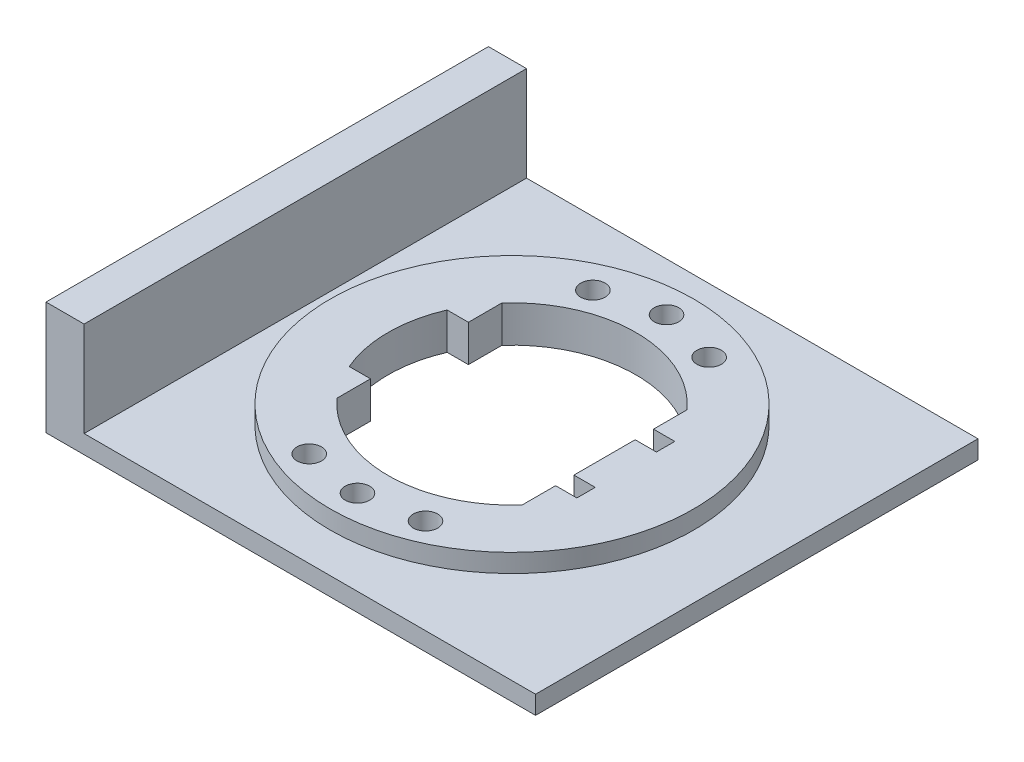
ISO-10303-21;
HEADER;
FILE_DESCRIPTION(('STEP AP214'),'2;1');
FILE_NAME('part.step','',(''),(''),'','','');
FILE_SCHEMA(('AUTOMOTIVE_DESIGN { 1 0 10303 214 1 1 1 1 }'));
ENDSEC;
DATA;
#1=APPLICATION_CONTEXT('core data for automotive mechanical design processes');
#2=APPLICATION_PROTOCOL_DEFINITION('international standard','automotive_design',2000,#1);
#3=PRODUCT_CONTEXT('',#1,'mechanical');
#4=PRODUCT('Part','Part','',(#3));
#5=PRODUCT_RELATED_PRODUCT_CATEGORY('part','',(#4));
#6=PRODUCT_DEFINITION_FORMATION('','',#4);
#7=PRODUCT_DEFINITION_CONTEXT('part definition',#1,'design');
#8=PRODUCT_DEFINITION('design','',#6,#7);
#9=PRODUCT_DEFINITION_SHAPE('','',#8);
#10=(LENGTH_UNIT() NAMED_UNIT(*) SI_UNIT(.MILLI.,.METRE.));
#11=(NAMED_UNIT(*) PLANE_ANGLE_UNIT() SI_UNIT($,.RADIAN.));
#12=(NAMED_UNIT(*) SI_UNIT($,.STERADIAN.) SOLID_ANGLE_UNIT());
#13=UNCERTAINTY_MEASURE_WITH_UNIT(LENGTH_MEASURE(1.E-05),#10,'distance_accuracy_value','');
#14=(GEOMETRIC_REPRESENTATION_CONTEXT(3) GLOBAL_UNCERTAINTY_ASSIGNED_CONTEXT((#13)) GLOBAL_UNIT_ASSIGNED_CONTEXT((#10,
#11,#12)) REPRESENTATION_CONTEXT('',''));
#15=CARTESIAN_POINT('',(0.,0.,0.));
#16=DIRECTION('',(0.,0.,1.));
#17=DIRECTION('',(1.,0.,0.));
#18=AXIS2_PLACEMENT_3D('',#15,#16,#17);
#19=CARTESIAN_POINT('',(-38.4533424136748,3.,-1.51012870901468));
#20=DIRECTION('',(0.,1.,0.));
#21=DIRECTION('',(0.,0.,1.));
#22=AXIS2_PLACEMENT_3D('',#19,#20,#21);
#23=PLANE('',#22);
#24=CARTESIAN_POINT('',(1.54665758632518,3.,-37.6601287090147));
#25=DIRECTION('',(0.,1.,0.));
#26=DIRECTION('',(0.,0.,1.));
#27=AXIS2_PLACEMENT_3D('',#24,#25,#26);
#28=CIRCLE('',#27,29.705);
#29=CARTESIAN_POINT('',(1.54665758632518,3.,-7.95512870901468));
#30=VERTEX_POINT('',#29);
#31=EDGE_CURVE('E367',#30,#30,#28,.T.);
#32=ORIENTED_EDGE('',*,*,#31,.F.);
#33=EDGE_LOOP('',(#32));
#34=FACE_BOUND('',#33,.T.);
#35=DIRECTION('',(-1.,0.,0.));
#36=VECTOR('',#35,1.);
#37=CARTESIAN_POINT('',(-38.4533424136748,3.,-73.8101287090147));
#38=LINE('',#37,#36);
#39=CARTESIAN_POINT('',(41.5466575863252,3.,-73.8101287090147));
#40=VERTEX_POINT('',#39);
#41=CARTESIAN_POINT('',(-32.2275933760281,3.,-73.8101287090147));
#42=VERTEX_POINT('',#41);
#43=EDGE_CURVE('E46',#40,#42,#38,.T.);
#44=ORIENTED_EDGE('',*,*,#43,.T.);
#45=DIRECTION('',(0.,0.,-1.));
#46=VECTOR('',#45,1.);
#47=CARTESIAN_POINT('',(-32.2275933760281,3.,-73.8101287090147));
#48=LINE('',#47,#46);
#49=CARTESIAN_POINT('',(-32.2275933760281,3.,-1.51012870901468));
#50=VERTEX_POINT('',#49);
#51=EDGE_CURVE('E50',#50,#42,#48,.T.);
#52=ORIENTED_EDGE('',*,*,#51,.F.);
#53=DIRECTION('',(1.,0.,0.));
#54=VECTOR('',#53,1.);
#55=CARTESIAN_POINT('',(-38.4533424136748,3.,-1.51012870901468));
#56=LINE('',#55,#54);
#57=CARTESIAN_POINT('',(41.5466575863252,3.,-1.51012870901468));
#58=VERTEX_POINT('',#57);
#59=EDGE_CURVE('E370',#50,#58,#56,.T.);
#60=ORIENTED_EDGE('',*,*,#59,.T.);
#61=DIRECTION('',(0.,0.,-1.));
#62=VECTOR('',#61,1.);
#63=CARTESIAN_POINT('',(41.5466575863252,3.,-73.8101287090147));
#64=LINE('',#63,#62);
#65=EDGE_CURVE('E374',#58,#40,#64,.T.);
#66=ORIENTED_EDGE('',*,*,#65,.T.);
#67=EDGE_LOOP('',(#44,#52,#60,#66));
#68=FACE_BOUND('',#67,.T.);
#69=ADVANCED_FACE('F31',(#34,#68),#23,.T.);
#70=CARTESIAN_POINT('',(-38.4533424136748,0.,-73.8101287090147));
#71=DIRECTION('',(0.,-1.,0.));
#72=DIRECTION('',(0.,0.,-1.));
#73=AXIS2_PLACEMENT_3D('',#70,#71,#72);
#74=PLANE('',#73);
#75=CARTESIAN_POINT('',(-7.95334241367481,0.,-14.0265658129032));
#76=DIRECTION('',(0.,1.,0.));
#77=DIRECTION('',(0.,0.,1.));
#78=AXIS2_PLACEMENT_3D('',#75,#76,#77);
#79=CIRCLE('',#78,2.00000000000001);
#80=CARTESIAN_POINT('',(-7.95334241367481,0.,-12.0265658129032));
#81=VERTEX_POINT('',#80);
#82=EDGE_CURVE('E208',#81,#81,#79,.T.);
#83=ORIENTED_EDGE('',*,*,#82,.T.);
#84=EDGE_LOOP('',(#83));
#85=FACE_BOUND('',#84,.T.);
#86=CARTESIAN_POINT('',(11.0466575863252,0.,-14.0265658129032));
#87=DIRECTION('',(0.,1.,0.));
#88=DIRECTION('',(0.,0.,1.));
#89=AXIS2_PLACEMENT_3D('',#86,#87,#88);
#90=CIRCLE('',#89,2.);
#91=CARTESIAN_POINT('',(11.0466575863252,0.,-12.0265658129032));
#92=VERTEX_POINT('',#91);
#93=EDGE_CURVE('E214',#92,#92,#90,.T.);
#94=ORIENTED_EDGE('',*,*,#93,.T.);
#95=EDGE_LOOP('',(#94));
#96=FACE_BOUND('',#95,.T.);
#97=CARTESIAN_POINT('',(11.0466575863252,0.,-60.3765658129032));
#98=DIRECTION('',(0.,1.,0.));
#99=DIRECTION('',(0.,0.,1.));
#100=AXIS2_PLACEMENT_3D('',#97,#98,#99);
#101=CIRCLE('',#100,2.);
#102=CARTESIAN_POINT('',(11.0466575863252,0.,-58.3765658129032));
#103=VERTEX_POINT('',#102);
#104=EDGE_CURVE('E220',#103,#103,#101,.T.);
#105=ORIENTED_EDGE('',*,*,#104,.T.);
#106=EDGE_LOOP('',(#105));
#107=FACE_BOUND('',#106,.T.);
#108=CARTESIAN_POINT('',(-7.95334241367482,0.,-60.3765658129032));
#109=DIRECTION('',(0.,1.,0.));
#110=DIRECTION('',(0.,0.,1.));
#111=AXIS2_PLACEMENT_3D('',#108,#109,#110);
#112=CIRCLE('',#111,2.00000000000001);
#113=CARTESIAN_POINT('',(-7.95334241367482,0.,-58.3765658129032));
#114=VERTEX_POINT('',#113);
#115=EDGE_CURVE('E226',#114,#114,#112,.T.);
#116=ORIENTED_EDGE('',*,*,#115,.T.);
#117=EDGE_LOOP('',(#116));
#118=FACE_BOUND('',#117,.T.);
#119=CARTESIAN_POINT('',(1.54665758632519,0.,-62.9101287090147));
#120=DIRECTION('',(0.,1.,0.));
#121=DIRECTION('',(0.,0.,1.));
#122=AXIS2_PLACEMENT_3D('',#119,#120,#121);
#123=CIRCLE('',#122,2.);
#124=CARTESIAN_POINT('',(1.54665758632519,0.,-60.9101287090147));
#125=VERTEX_POINT('',#124);
#126=EDGE_CURVE('E232',#125,#125,#123,.T.);
#127=ORIENTED_EDGE('',*,*,#126,.T.);
#128=EDGE_LOOP('',(#127));
#129=FACE_BOUND('',#128,.T.);
#130=CARTESIAN_POINT('',(1.54665758632519,0.,-12.4101287090147));
#131=DIRECTION('',(0.,1.,0.));
#132=DIRECTION('',(0.,0.,1.));
#133=AXIS2_PLACEMENT_3D('',#130,#131,#132);
#134=CIRCLE('',#133,2.);
#135=CARTESIAN_POINT('',(1.54665758632519,0.,-10.4101287090147));
#136=VERTEX_POINT('',#135);
#137=EDGE_CURVE('E238',#136,#136,#134,.T.);
#138=ORIENTED_EDGE('',*,*,#137,.T.);
#139=EDGE_LOOP('',(#138));
#140=FACE_BOUND('',#139,.T.);
#141=DIRECTION('',(0.,0.,1.));
#142=VECTOR('',#141,1.);
#143=CARTESIAN_POINT('',(-38.4533424136748,0.,-1.51012870901468));
#144=LINE('',#143,#142);
#145=CARTESIAN_POINT('',(-38.4533424136748,0.,-73.8101287090147));
#146=VERTEX_POINT('',#145);
#147=CARTESIAN_POINT('',(-38.4533424136748,0.,-1.51012870901468));
#148=VERTEX_POINT('',#147);
#149=EDGE_CURVE('E181',#146,#148,#144,.T.);
#150=ORIENTED_EDGE('',*,*,#149,.F.);
#151=DIRECTION('',(-1.,0.,0.));
#152=VECTOR('',#151,1.);
#153=CARTESIAN_POINT('',(-38.4533424136748,0.,-73.8101287090147));
#154=LINE('',#153,#152);
#155=CARTESIAN_POINT('',(41.5466575863252,0.,-73.8101287090147));
#156=VERTEX_POINT('',#155);
#157=EDGE_CURVE('E383',#156,#146,#154,.T.);
#158=ORIENTED_EDGE('',*,*,#157,.F.);
#159=DIRECTION('',(0.,0.,-1.));
#160=VECTOR('',#159,1.);
#161=CARTESIAN_POINT('',(41.5466575863252,0.,-1.51012870901468));
#162=LINE('',#161,#160);
#163=CARTESIAN_POINT('',(41.5466575863252,0.,-1.51012870901468));
#164=VERTEX_POINT('',#163);
#165=EDGE_CURVE('E380',#164,#156,#162,.T.);
#166=ORIENTED_EDGE('',*,*,#165,.F.);
#167=DIRECTION('',(1.,0.,0.));
#168=VECTOR('',#167,1.);
#169=CARTESIAN_POINT('',(-38.4533424136748,0.,-1.51012870901468));
#170=LINE('',#169,#168);
#171=EDGE_CURVE('E378',#148,#164,#170,.T.);
#172=ORIENTED_EDGE('',*,*,#171,.F.);
#173=EDGE_LOOP('',(#150,#158,#166,#172));
#174=FACE_BOUND('',#173,.T.);
#175=DIRECTION('',(0.,0.,1.));
#176=VECTOR('',#175,1.);
#177=CARTESIAN_POINT('',(-13.5780333196074,0.,-37.6601287090147));
#178=LINE('',#177,#176);
#179=CARTESIAN_POINT('',(-13.5780333196074,0.,-51.1251287090147));
#180=VERTEX_POINT('',#179);
#181=CARTESIAN_POINT('',(-13.5780333196074,0.,-45.6601287090147));
#182=VERTEX_POINT('',#181);
#183=EDGE_CURVE('E284',#180,#182,#178,.T.);
#184=ORIENTED_EDGE('',*,*,#183,.T.);
#185=DIRECTION('',(1.,0.,0.));
#186=VECTOR('',#185,1.);
#187=CARTESIAN_POINT('',(-63.9457637699121,0.,-45.6601287090147));
#188=LINE('',#187,#186);
#189=CARTESIAN_POINT('',(-17.0560975859605,0.,-45.6601287090147));
#190=VERTEX_POINT('',#189);
#191=EDGE_CURVE('E244',#190,#182,#188,.T.);
#192=ORIENTED_EDGE('',*,*,#191,.F.);
#193=CARTESIAN_POINT('',(1.54665758632518,0.,-37.6601287090147));
#194=DIRECTION('',(0.,1.,0.));
#195=DIRECTION('',(0.,0.,1.));
#196=AXIS2_PLACEMENT_3D('',#193,#194,#195);
#197=CIRCLE('',#196,20.25);
#198=CARTESIAN_POINT('',(-17.0560975859605,0.,-29.6601287090147));
#199=VERTEX_POINT('',#198);
#200=EDGE_CURVE('E246',#190,#199,#197,.T.);
#201=ORIENTED_EDGE('',*,*,#200,.T.);
#202=DIRECTION('',(1.,0.,0.));
#203=VECTOR('',#202,1.);
#204=CARTESIAN_POINT('',(-63.9457637699121,0.,-29.6601287090147));
#205=LINE('',#204,#203);
#206=CARTESIAN_POINT('',(-13.5780333196074,0.,-29.6601287090147));
#207=VERTEX_POINT('',#206);
#208=EDGE_CURVE('E250',#199,#207,#205,.T.);
#209=ORIENTED_EDGE('',*,*,#208,.T.);
#210=DIRECTION('',(0.,0.,1.));
#211=VECTOR('',#210,1.);
#212=CARTESIAN_POINT('',(-13.5780333196074,0.,-37.6601287090147));
#213=LINE('',#212,#211);
#214=CARTESIAN_POINT('',(-13.5780333196074,0.,-24.1951287090147));
#215=VERTEX_POINT('',#214);
#216=EDGE_CURVE('E253',#207,#215,#213,.T.);
#217=ORIENTED_EDGE('',*,*,#216,.T.);
#218=CARTESIAN_POINT('',(1.54665758632518,0.,-37.6601287090147));
#219=DIRECTION('',(0.,1.,0.));
#220=DIRECTION('',(0.,0.,1.));
#221=AXIS2_PLACEMENT_3D('',#218,#219,#220);
#222=CIRCLE('',#221,20.25);
#223=CARTESIAN_POINT('',(16.6713484922578,0.,-24.1951287090147));
#224=VERTEX_POINT('',#223);
#225=EDGE_CURVE('E256',#215,#224,#222,.T.);
#226=ORIENTED_EDGE('',*,*,#225,.T.);
#227=DIRECTION('',(0.,0.,1.));
#228=VECTOR('',#227,1.);
#229=CARTESIAN_POINT('',(16.6713484922578,0.,-37.6601287090147));
#230=LINE('',#229,#228);
#231=CARTESIAN_POINT('',(16.6713484922578,0.,-29.6601287090147));
#232=VERTEX_POINT('',#231);
#233=EDGE_CURVE('E259',#232,#224,#230,.T.);
#234=ORIENTED_EDGE('',*,*,#233,.F.);
#235=DIRECTION('',(1.,0.,0.));
#236=VECTOR('',#235,1.);
#237=CARTESIAN_POINT('',(-63.9457637699121,0.,-29.6601287090147));
#238=LINE('',#237,#236);
#239=CARTESIAN_POINT('',(20.1494127586108,0.,-29.6601287090147));
#240=VERTEX_POINT('',#239);
#241=EDGE_CURVE('E261',#232,#240,#238,.T.);
#242=ORIENTED_EDGE('',*,*,#241,.T.);
#243=DIRECTION('',(0.,0.,-1.));
#244=VECTOR('',#243,1.);
#245=CARTESIAN_POINT('',(20.1494127586108,0.,-37.6601287090147));
#246=LINE('',#245,#244);
#247=CARTESIAN_POINT('',(20.1494127586108,0.,-32.6601287090147));
#248=VERTEX_POINT('',#247);
#249=EDGE_CURVE('E264',#240,#248,#246,.T.);
#250=ORIENTED_EDGE('',*,*,#249,.T.);
#251=DIRECTION('',(-1.,0.,0.));
#252=VECTOR('',#251,1.);
#253=CARTESIAN_POINT('',(-63.9457637699121,0.,-32.6601287090148));
#254=LINE('',#253,#252);
#255=CARTESIAN_POINT('',(16.6713484922578,0.,-32.6601287090147));
#256=VERTEX_POINT('',#255);
#257=EDGE_CURVE('E267',#248,#256,#254,.T.);
#258=ORIENTED_EDGE('',*,*,#257,.T.);
#259=DIRECTION('',(0.,0.,1.));
#260=VECTOR('',#259,1.);
#261=CARTESIAN_POINT('',(16.6713484922578,0.,-37.6601287090147));
#262=LINE('',#261,#260);
#263=CARTESIAN_POINT('',(16.6713484922578,0.,-42.6601287090147));
#264=VERTEX_POINT('',#263);
#265=EDGE_CURVE('E270',#264,#256,#262,.T.);
#266=ORIENTED_EDGE('',*,*,#265,.F.);
#267=DIRECTION('',(-1.,0.,0.));
#268=VECTOR('',#267,1.);
#269=CARTESIAN_POINT('',(-63.9457637699121,0.,-42.6601287090147));
#270=LINE('',#269,#268);
#271=CARTESIAN_POINT('',(20.1494127586108,0.,-42.6601287090147));
#272=VERTEX_POINT('',#271);
#273=EDGE_CURVE('E272',#272,#264,#270,.T.);
#274=ORIENTED_EDGE('',*,*,#273,.F.);
#275=DIRECTION('',(0.,0.,-1.));
#276=VECTOR('',#275,1.);
#277=CARTESIAN_POINT('',(20.1494127586108,0.,-37.6601287090147));
#278=LINE('',#277,#276);
#279=CARTESIAN_POINT('',(20.1494127586108,0.,-45.6601287090147));
#280=VERTEX_POINT('',#279);
#281=EDGE_CURVE('E274',#272,#280,#278,.T.);
#282=ORIENTED_EDGE('',*,*,#281,.T.);
#283=DIRECTION('',(1.,0.,0.));
#284=VECTOR('',#283,1.);
#285=CARTESIAN_POINT('',(-63.9457637699121,0.,-45.6601287090147));
#286=LINE('',#285,#284);
#287=CARTESIAN_POINT('',(16.6713484922578,0.,-45.6601287090147));
#288=VERTEX_POINT('',#287);
#289=EDGE_CURVE('E277',#288,#280,#286,.T.);
#290=ORIENTED_EDGE('',*,*,#289,.F.);
#291=DIRECTION('',(0.,0.,1.));
#292=VECTOR('',#291,1.);
#293=CARTESIAN_POINT('',(16.6713484922578,0.,-37.6601287090147));
#294=LINE('',#293,#292);
#295=CARTESIAN_POINT('',(16.6713484922578,0.,-51.1251287090147));
#296=VERTEX_POINT('',#295);
#297=EDGE_CURVE('E279',#296,#288,#294,.T.);
#298=ORIENTED_EDGE('',*,*,#297,.F.);
#299=CARTESIAN_POINT('',(1.54665758632518,0.,-37.6601287090147));
#300=DIRECTION('',(0.,1.,0.));
#301=DIRECTION('',(0.,0.,1.));
#302=AXIS2_PLACEMENT_3D('',#299,#300,#301);
#303=CIRCLE('',#302,20.25);
#304=EDGE_CURVE('E281',#296,#180,#303,.T.);
#305=ORIENTED_EDGE('',*,*,#304,.T.);
#306=EDGE_LOOP('',(#184,#192,#201,#209,#217,#226,#234,#242,#250,#258,#266,#274,#282,#290,#298,#305));
#307=FACE_BOUND('',#306,.T.);
#308=ADVANCED_FACE('F397',(#85,#96,#107,#118,#129,#140,#174,#307),#74,.T.);
#309=CARTESIAN_POINT('',(-38.4533424136748,6.,-73.8101287090147));
#310=DIRECTION('',(0.,-1.,0.));
#311=DIRECTION('',(0.,0.,-1.));
#312=AXIS2_PLACEMENT_3D('',#309,#310,#311);
#313=PLANE('',#312);
#314=CARTESIAN_POINT('',(-7.95334241367481,6.,-14.0265658129032));
#315=DIRECTION('',(0.,1.,0.));
#316=DIRECTION('',(0.,0.,1.));
#317=AXIS2_PLACEMENT_3D('',#314,#315,#316);
#318=CIRCLE('',#317,2.00000000000001);
#319=CARTESIAN_POINT('',(-7.95334241367481,6.,-12.0265658129032));
#320=VERTEX_POINT('',#319);
#321=EDGE_CURVE('E207',#320,#320,#318,.T.);
#322=ORIENTED_EDGE('',*,*,#321,.F.);
#323=EDGE_LOOP('',(#322));
#324=FACE_BOUND('',#323,.T.);
#325=CARTESIAN_POINT('',(11.0466575863252,6.,-14.0265658129032));
#326=DIRECTION('',(0.,1.,0.));
#327=DIRECTION('',(0.,0.,1.));
#328=AXIS2_PLACEMENT_3D('',#325,#326,#327);
#329=CIRCLE('',#328,2.);
#330=CARTESIAN_POINT('',(11.0466575863252,6.,-12.0265658129032));
#331=VERTEX_POINT('',#330);
#332=EDGE_CURVE('E211',#331,#331,#329,.T.);
#333=ORIENTED_EDGE('',*,*,#332,.F.);
#334=EDGE_LOOP('',(#333));
#335=FACE_BOUND('',#334,.T.);
#336=CARTESIAN_POINT('',(11.0466575863252,6.,-60.3765658129032));
#337=DIRECTION('',(0.,1.,0.));
#338=DIRECTION('',(0.,0.,1.));
#339=AXIS2_PLACEMENT_3D('',#336,#337,#338);
#340=CIRCLE('',#339,2.);
#341=CARTESIAN_POINT('',(11.0466575863252,6.,-58.3765658129032));
#342=VERTEX_POINT('',#341);
#343=EDGE_CURVE('E217',#342,#342,#340,.T.);
#344=ORIENTED_EDGE('',*,*,#343,.F.);
#345=EDGE_LOOP('',(#344));
#346=FACE_BOUND('',#345,.T.);
#347=CARTESIAN_POINT('',(-7.95334241367482,6.,-60.3765658129032));
#348=DIRECTION('',(0.,1.,0.));
#349=DIRECTION('',(0.,0.,1.));
#350=AXIS2_PLACEMENT_3D('',#347,#348,#349);
#351=CIRCLE('',#350,2.00000000000001);
#352=CARTESIAN_POINT('',(-7.95334241367482,6.,-58.3765658129032));
#353=VERTEX_POINT('',#352);
#354=EDGE_CURVE('E223',#353,#353,#351,.T.);
#355=ORIENTED_EDGE('',*,*,#354,.F.);
#356=EDGE_LOOP('',(#355));
#357=FACE_BOUND('',#356,.T.);
#358=CARTESIAN_POINT('',(1.54665758632519,6.,-62.9101287090147));
#359=DIRECTION('',(0.,1.,0.));
#360=DIRECTION('',(0.,0.,1.));
#361=AXIS2_PLACEMENT_3D('',#358,#359,#360);
#362=CIRCLE('',#361,2.);
#363=CARTESIAN_POINT('',(1.54665758632519,6.,-60.9101287090147));
#364=VERTEX_POINT('',#363);
#365=EDGE_CURVE('E229',#364,#364,#362,.T.);
#366=ORIENTED_EDGE('',*,*,#365,.F.);
#367=EDGE_LOOP('',(#366));
#368=FACE_BOUND('',#367,.T.);
#369=CARTESIAN_POINT('',(1.54665758632519,6.,-12.4101287090147));
#370=DIRECTION('',(0.,1.,0.));
#371=DIRECTION('',(0.,0.,1.));
#372=AXIS2_PLACEMENT_3D('',#369,#370,#371);
#373=CIRCLE('',#372,2.);
#374=CARTESIAN_POINT('',(1.54665758632519,6.,-10.4101287090147));
#375=VERTEX_POINT('',#374);
#376=EDGE_CURVE('E235',#375,#375,#373,.T.);
#377=ORIENTED_EDGE('',*,*,#376,.F.);
#378=EDGE_LOOP('',(#377));
#379=FACE_BOUND('',#378,.T.);
#380=CARTESIAN_POINT('',(1.54665758632518,6.,-37.6601287090147));
#381=DIRECTION('',(0.,1.,0.));
#382=DIRECTION('',(0.,0.,1.));
#383=AXIS2_PLACEMENT_3D('',#380,#381,#382);
#384=CIRCLE('',#383,29.705);
#385=CARTESIAN_POINT('',(1.54665758632518,6.,-7.95512870901468));
#386=VERTEX_POINT('',#385);
#387=EDGE_CURVE('E336',#386,#386,#384,.T.);
#388=ORIENTED_EDGE('',*,*,#387,.T.);
#389=EDGE_LOOP('',(#388));
#390=FACE_BOUND('',#389,.T.);
#391=DIRECTION('',(1.,0.,0.));
#392=VECTOR('',#391,1.);
#393=CARTESIAN_POINT('',(-63.9457637699121,6.,-45.6601287090147));
#394=LINE('',#393,#392);
#395=CARTESIAN_POINT('',(-17.0560975859605,6.,-45.6601287090147));
#396=VERTEX_POINT('',#395);
#397=CARTESIAN_POINT('',(-13.5780333196074,6.,-45.6601287090147));
#398=VERTEX_POINT('',#397);
#399=EDGE_CURVE('E241',#396,#398,#394,.T.);
#400=ORIENTED_EDGE('',*,*,#399,.T.);
#401=DIRECTION('',(0.,0.,1.));
#402=VECTOR('',#401,1.);
#403=CARTESIAN_POINT('',(-13.5780333196074,6.,-37.6601287090147));
#404=LINE('',#403,#402);
#405=CARTESIAN_POINT('',(-13.5780333196074,6.,-51.1251287090147));
#406=VERTEX_POINT('',#405);
#407=EDGE_CURVE('E247',#406,#398,#404,.T.);
#408=ORIENTED_EDGE('',*,*,#407,.F.);
#409=CARTESIAN_POINT('',(1.54665758632518,6.,-37.6601287090147));
#410=DIRECTION('',(0.,1.,0.));
#411=DIRECTION('',(0.,0.,1.));
#412=AXIS2_PLACEMENT_3D('',#409,#410,#411);
#413=CIRCLE('',#412,20.25);
#414=CARTESIAN_POINT('',(16.6713484922578,6.,-51.1251287090147));
#415=VERTEX_POINT('',#414);
#416=EDGE_CURVE('E329',#415,#406,#413,.T.);
#417=ORIENTED_EDGE('',*,*,#416,.F.);
#418=DIRECTION('',(0.,0.,1.));
#419=VECTOR('',#418,1.);
#420=CARTESIAN_POINT('',(16.6713484922578,6.,-37.6601287090147));
#421=LINE('',#420,#419);
#422=CARTESIAN_POINT('',(16.6713484922578,6.,-45.6601287090147));
#423=VERTEX_POINT('',#422);
#424=EDGE_CURVE('E326',#415,#423,#421,.T.);
#425=ORIENTED_EDGE('',*,*,#424,.T.);
#426=DIRECTION('',(1.,0.,0.));
#427=VECTOR('',#426,1.);
#428=CARTESIAN_POINT('',(-63.9457637699121,6.,-45.6601287090147));
#429=LINE('',#428,#427);
#430=CARTESIAN_POINT('',(20.1494127586108,6.,-45.6601287090147));
#431=VERTEX_POINT('',#430);
#432=EDGE_CURVE('E323',#423,#431,#429,.T.);
#433=ORIENTED_EDGE('',*,*,#432,.T.);
#434=DIRECTION('',(0.,0.,-1.));
#435=VECTOR('',#434,1.);
#436=CARTESIAN_POINT('',(20.1494127586108,6.,-37.6601287090147));
#437=LINE('',#436,#435);
#438=CARTESIAN_POINT('',(20.1494127586108,6.,-42.6601287090147));
#439=VERTEX_POINT('',#438);
#440=EDGE_CURVE('E320',#439,#431,#437,.T.);
#441=ORIENTED_EDGE('',*,*,#440,.F.);
#442=DIRECTION('',(-1.,0.,0.));
#443=VECTOR('',#442,1.);
#444=CARTESIAN_POINT('',(-63.9457637699121,6.,-42.6601287090147));
#445=LINE('',#444,#443);
#446=CARTESIAN_POINT('',(16.6713484922578,6.,-42.6601287090147));
#447=VERTEX_POINT('',#446);
#448=EDGE_CURVE('E317',#439,#447,#445,.T.);
#449=ORIENTED_EDGE('',*,*,#448,.T.);
#450=DIRECTION('',(0.,0.,1.));
#451=VECTOR('',#450,1.);
#452=CARTESIAN_POINT('',(16.6713484922578,6.,-37.6601287090147));
#453=LINE('',#452,#451);
#454=CARTESIAN_POINT('',(16.6713484922578,6.,-32.6601287090147));
#455=VERTEX_POINT('',#454);
#456=EDGE_CURVE('E314',#447,#455,#453,.T.);
#457=ORIENTED_EDGE('',*,*,#456,.T.);
#458=DIRECTION('',(-1.,0.,0.));
#459=VECTOR('',#458,1.);
#460=CARTESIAN_POINT('',(-63.9457637699121,6.,-32.6601287090148));
#461=LINE('',#460,#459);
#462=CARTESIAN_POINT('',(20.1494127586108,6.,-32.6601287090147));
#463=VERTEX_POINT('',#462);
#464=EDGE_CURVE('E311',#463,#455,#461,.T.);
#465=ORIENTED_EDGE('',*,*,#464,.F.);
#466=DIRECTION('',(0.,0.,-1.));
#467=VECTOR('',#466,1.);
#468=CARTESIAN_POINT('',(20.1494127586108,6.,-37.6601287090147));
#469=LINE('',#468,#467);
#470=CARTESIAN_POINT('',(20.1494127586108,6.,-29.6601287090147));
#471=VERTEX_POINT('',#470);
#472=EDGE_CURVE('E308',#471,#463,#469,.T.);
#473=ORIENTED_EDGE('',*,*,#472,.F.);
#474=DIRECTION('',(1.,0.,0.));
#475=VECTOR('',#474,1.);
#476=CARTESIAN_POINT('',(-63.9457637699121,6.,-29.6601287090147));
#477=LINE('',#476,#475);
#478=CARTESIAN_POINT('',(16.6713484922578,6.,-29.6601287090147));
#479=VERTEX_POINT('',#478);
#480=EDGE_CURVE('E305',#479,#471,#477,.T.);
#481=ORIENTED_EDGE('',*,*,#480,.F.);
#482=DIRECTION('',(0.,0.,1.));
#483=VECTOR('',#482,1.);
#484=CARTESIAN_POINT('',(16.6713484922578,6.,-37.6601287090147));
#485=LINE('',#484,#483);
#486=CARTESIAN_POINT('',(16.6713484922578,6.,-24.1951287090147));
#487=VERTEX_POINT('',#486);
#488=EDGE_CURVE('E302',#479,#487,#485,.T.);
#489=ORIENTED_EDGE('',*,*,#488,.T.);
#490=CARTESIAN_POINT('',(1.54665758632518,6.,-37.6601287090147));
#491=DIRECTION('',(0.,1.,0.));
#492=DIRECTION('',(0.,0.,1.));
#493=AXIS2_PLACEMENT_3D('',#490,#491,#492);
#494=CIRCLE('',#493,20.25);
#495=CARTESIAN_POINT('',(-13.5780333196074,6.,-24.1951287090147));
#496=VERTEX_POINT('',#495);
#497=EDGE_CURVE('E299',#496,#487,#494,.T.);
#498=ORIENTED_EDGE('',*,*,#497,.F.);
#499=DIRECTION('',(0.,0.,1.));
#500=VECTOR('',#499,1.);
#501=CARTESIAN_POINT('',(-13.5780333196074,6.,-37.6601287090147));
#502=LINE('',#501,#500);
#503=CARTESIAN_POINT('',(-13.5780333196074,6.,-29.6601287090147));
#504=VERTEX_POINT('',#503);
#505=EDGE_CURVE('E296',#504,#496,#502,.T.);
#506=ORIENTED_EDGE('',*,*,#505,.F.);
#507=DIRECTION('',(1.,0.,0.));
#508=VECTOR('',#507,1.);
#509=CARTESIAN_POINT('',(-63.9457637699121,6.,-29.6601287090147));
#510=LINE('',#509,#508);
#511=CARTESIAN_POINT('',(-17.0560975859605,6.,-29.6601287090147));
#512=VERTEX_POINT('',#511);
#513=EDGE_CURVE('E293',#512,#504,#510,.T.);
#514=ORIENTED_EDGE('',*,*,#513,.F.);
#515=CARTESIAN_POINT('',(1.54665758632518,6.,-37.6601287090147));
#516=DIRECTION('',(0.,1.,0.));
#517=DIRECTION('',(0.,0.,1.));
#518=AXIS2_PLACEMENT_3D('',#515,#516,#517);
#519=CIRCLE('',#518,20.25);
#520=EDGE_CURVE('E290',#396,#512,#519,.T.);
#521=ORIENTED_EDGE('',*,*,#520,.F.);
#522=EDGE_LOOP('',(#400,#408,#417,#425,#433,#441,#449,#457,#465,#473,#481,#489,#498,#506,#514,#521));
#523=FACE_BOUND('',#522,.T.);
#524=ADVANCED_FACE('F421',(#324,#335,#346,#357,#368,#379,#390,#523),#313,.F.);
#525=CARTESIAN_POINT('',(-38.4533424136748,6.,-1.51012870901468));
#526=DIRECTION('',(1.,0.,0.));
#527=DIRECTION('',(0.,0.,-1.));
#528=AXIS2_PLACEMENT_3D('',#525,#526,#527);
#529=PLANE('',#528);
#530=DIRECTION('',(0.,-1.,0.));
#531=VECTOR('',#530,1.);
#532=CARTESIAN_POINT('',(-38.4533424136748,6.,-1.51012870901468));
#533=LINE('',#532,#531);
#534=CARTESIAN_POINT('',(-38.4533424136748,18.5,-1.51012870901468));
#535=VERTEX_POINT('',#534);
#536=EDGE_CURVE('E11',#535,#148,#533,.T.);
#537=ORIENTED_EDGE('',*,*,#536,.F.);
#538=DIRECTION('',(0.,0.,1.));
#539=VECTOR('',#538,1.);
#540=CARTESIAN_POINT('',(-38.4533424136748,18.5,-73.8101287090147));
#541=LINE('',#540,#539);
#542=CARTESIAN_POINT('',(-38.4533424136748,18.5,-73.8101287090147));
#543=VERTEX_POINT('',#542);
#544=EDGE_CURVE('E179',#543,#535,#541,.T.);
#545=ORIENTED_EDGE('',*,*,#544,.F.);
#546=DIRECTION('',(0.,-1.,0.));
#547=VECTOR('',#546,1.);
#548=CARTESIAN_POINT('',(-38.4533424136748,6.,-73.8101287090147));
#549=LINE('',#548,#547);
#550=EDGE_CURVE('E386',#543,#146,#549,.T.);
#551=ORIENTED_EDGE('',*,*,#550,.T.);
#552=ORIENTED_EDGE('',*,*,#149,.T.);
#553=EDGE_LOOP('',(#537,#545,#551,#552));
#554=FACE_BOUND('',#553,.T.);
#555=ADVANCED_FACE('F33',(#554),#529,.F.);
#556=CARTESIAN_POINT('',(-38.4533424136748,6.,-1.51012870901468));
#557=DIRECTION('',(0.,0.,-1.));
#558=DIRECTION('',(-1.,0.,0.));
#559=AXIS2_PLACEMENT_3D('',#556,#557,#558);
#560=PLANE('',#559);
#561=ORIENTED_EDGE('',*,*,#59,.F.);
#562=DIRECTION('',(0.,-1.,0.));
#563=VECTOR('',#562,1.);
#564=CARTESIAN_POINT('',(-32.2275933760281,18.5,-1.51012870901468));
#565=LINE('',#564,#563);
#566=CARTESIAN_POINT('',(-32.2275933760281,18.5,-1.51012870901468));
#567=VERTEX_POINT('',#566);
#568=EDGE_CURVE('E189',#567,#50,#565,.T.);
#569=ORIENTED_EDGE('',*,*,#568,.F.);
#570=DIRECTION('',(1.,0.,0.));
#571=VECTOR('',#570,1.);
#572=CARTESIAN_POINT('',(-38.4533424136748,18.5,-1.51012870901468));
#573=LINE('',#572,#571);
#574=EDGE_CURVE('E186',#535,#567,#573,.T.);
#575=ORIENTED_EDGE('',*,*,#574,.F.);
#576=ORIENTED_EDGE('',*,*,#536,.T.);
#577=ORIENTED_EDGE('',*,*,#171,.T.);
#578=DIRECTION('',(0.,-1.,0.));
#579=VECTOR('',#578,1.);
#580=CARTESIAN_POINT('',(41.5466575863252,6.,-1.51012870901468));
#581=LINE('',#580,#579);
#582=EDGE_CURVE('E39',#58,#164,#581,.T.);
#583=ORIENTED_EDGE('',*,*,#582,.F.);
#584=EDGE_LOOP('',(#561,#569,#575,#576,#577,#583));
#585=FACE_BOUND('',#584,.T.);
#586=ADVANCED_FACE('F187',(#585),#560,.F.);
#587=CARTESIAN_POINT('',(41.5466575863252,6.,-1.51012870901468));
#588=DIRECTION('',(-1.,0.,0.));
#589=DIRECTION('',(0.,0.,1.));
#590=AXIS2_PLACEMENT_3D('',#587,#588,#589);
#591=PLANE('',#590);
#592=ORIENTED_EDGE('',*,*,#65,.F.);
#593=ORIENTED_EDGE('',*,*,#582,.T.);
#594=ORIENTED_EDGE('',*,*,#165,.T.);
#595=DIRECTION('',(0.,-1.,0.));
#596=VECTOR('',#595,1.);
#597=CARTESIAN_POINT('',(41.5466575863252,6.,-73.8101287090147));
#598=LINE('',#597,#596);
#599=EDGE_CURVE('E388',#40,#156,#598,.T.);
#600=ORIENTED_EDGE('',*,*,#599,.F.);
#601=EDGE_LOOP('',(#592,#593,#594,#600));
#602=FACE_BOUND('',#601,.T.);
#603=ADVANCED_FACE('F392',(#602),#591,.F.);
#604=CARTESIAN_POINT('',(-38.4533424136748,6.,-73.8101287090147));
#605=DIRECTION('',(0.,0.,1.));
#606=DIRECTION('',(1.,0.,0.));
#607=AXIS2_PLACEMENT_3D('',#604,#605,#606);
#608=PLANE('',#607);
#609=ORIENTED_EDGE('',*,*,#43,.F.);
#610=ORIENTED_EDGE('',*,*,#599,.T.);
#611=ORIENTED_EDGE('',*,*,#157,.T.);
#612=ORIENTED_EDGE('',*,*,#550,.F.);
#613=DIRECTION('',(-1.,0.,0.));
#614=VECTOR('',#613,1.);
#615=CARTESIAN_POINT('',(-38.4533424136748,18.5,-73.8101287090147));
#616=LINE('',#615,#614);
#617=CARTESIAN_POINT('',(-32.2275933760281,18.5,-73.8101287090147));
#618=VERTEX_POINT('',#617);
#619=EDGE_CURVE('E197',#618,#543,#616,.T.);
#620=ORIENTED_EDGE('',*,*,#619,.F.);
#621=DIRECTION('',(0.,-1.,0.));
#622=VECTOR('',#621,1.);
#623=CARTESIAN_POINT('',(-32.2275933760281,18.5,-73.8101287090147));
#624=LINE('',#623,#622);
#625=EDGE_CURVE('E202',#618,#42,#624,.T.);
#626=ORIENTED_EDGE('',*,*,#625,.T.);
#627=EDGE_LOOP('',(#609,#610,#611,#612,#620,#626));
#628=FACE_BOUND('',#627,.T.);
#629=ADVANCED_FACE('F400',(#628),#608,.F.);
#630=CARTESIAN_POINT('',(1.54665758632518,3.,-37.6601287090147));
#631=DIRECTION('',(0.,1.,0.));
#632=DIRECTION('',(0.,0.,1.));
#633=AXIS2_PLACEMENT_3D('',#630,#631,#632);
#634=CYLINDRICAL_SURFACE('',#633,29.705);
#635=ORIENTED_EDGE('',*,*,#31,.T.);
#636=EDGE_LOOP('',(#635));
#637=FACE_BOUND('',#636,.T.);
#638=ORIENTED_EDGE('',*,*,#387,.F.);
#639=EDGE_LOOP('',(#638));
#640=FACE_BOUND('',#639,.T.);
#641=ADVANCED_FACE('F427',(#637,#640),#634,.T.);
#642=CARTESIAN_POINT('',(-63.9457637699121,0.,-45.6601287090147));
#643=DIRECTION('',(0.,0.,1.));
#644=DIRECTION('',(1.,0.,0.));
#645=AXIS2_PLACEMENT_3D('',#642,#643,#644);
#646=PLANE('',#645);
#647=ORIENTED_EDGE('',*,*,#399,.F.);
#648=DIRECTION('',(0.,1.,0.));
#649=VECTOR('',#648,1.);
#650=CARTESIAN_POINT('',(-17.0560975859605,0.,-45.6601287090147));
#651=LINE('',#650,#649);
#652=EDGE_CURVE('E287',#190,#396,#651,.T.);
#653=ORIENTED_EDGE('',*,*,#652,.F.);
#654=ORIENTED_EDGE('',*,*,#191,.T.);
#655=DIRECTION('',(0.,1.,0.));
#656=VECTOR('',#655,1.);
#657=CARTESIAN_POINT('',(-13.5780333196074,0.,-45.6601287090147));
#658=LINE('',#657,#656);
#659=EDGE_CURVE('E334',#182,#398,#658,.T.);
#660=ORIENTED_EDGE('',*,*,#659,.T.);
#661=EDGE_LOOP('',(#647,#653,#654,#660));
#662=FACE_BOUND('',#661,.T.);
#663=ADVANCED_FACE('F630',(#662),#646,.T.);
#664=CARTESIAN_POINT('',(-13.5780333196074,0.,-37.6601287090147));
#665=DIRECTION('',(-1.,0.,0.));
#666=DIRECTION('',(0.,0.,1.));
#667=AXIS2_PLACEMENT_3D('',#664,#665,#666);
#668=PLANE('',#667);
#669=ORIENTED_EDGE('',*,*,#407,.T.);
#670=ORIENTED_EDGE('',*,*,#659,.F.);
#671=ORIENTED_EDGE('',*,*,#183,.F.);
#672=DIRECTION('',(0.,1.,0.));
#673=VECTOR('',#672,1.);
#674=CARTESIAN_POINT('',(-13.5780333196074,0.,-51.1251287090147));
#675=LINE('',#674,#673);
#676=EDGE_CURVE('E337',#180,#406,#675,.T.);
#677=ORIENTED_EDGE('',*,*,#676,.T.);
#678=EDGE_LOOP('',(#669,#670,#671,#677));
#679=FACE_BOUND('',#678,.T.);
#680=ADVANCED_FACE('F620',(#679),#668,.F.);
#681=CARTESIAN_POINT('',(1.54665758632518,0.,-37.6601287090147));
#682=DIRECTION('',(0.,1.,0.));
#683=DIRECTION('',(0.,0.,1.));
#684=AXIS2_PLACEMENT_3D('',#681,#682,#683);
#685=CYLINDRICAL_SURFACE('',#684,20.25);
#686=ORIENTED_EDGE('',*,*,#416,.T.);
#687=ORIENTED_EDGE('',*,*,#676,.F.);
#688=ORIENTED_EDGE('',*,*,#304,.F.);
#689=DIRECTION('',(0.,1.,0.));
#690=VECTOR('',#689,1.);
#691=CARTESIAN_POINT('',(16.6713484922578,0.,-51.1251287090147));
#692=LINE('',#691,#690);
#693=EDGE_CURVE('E339',#296,#415,#692,.T.);
#694=ORIENTED_EDGE('',*,*,#693,.T.);
#695=EDGE_LOOP('',(#686,#687,#688,#694));
#696=FACE_BOUND('',#695,.T.);
#697=ADVANCED_FACE('F610',(#696),#685,.F.);
#698=CARTESIAN_POINT('',(16.6713484922578,0.,-37.6601287090147));
#699=DIRECTION('',(-1.,0.,0.));
#700=DIRECTION('',(0.,0.,1.));
#701=AXIS2_PLACEMENT_3D('',#698,#699,#700);
#702=PLANE('',#701);
#703=ORIENTED_EDGE('',*,*,#424,.F.);
#704=ORIENTED_EDGE('',*,*,#693,.F.);
#705=ORIENTED_EDGE('',*,*,#297,.T.);
#706=DIRECTION('',(0.,1.,0.));
#707=VECTOR('',#706,1.);
#708=CARTESIAN_POINT('',(16.6713484922578,0.,-45.6601287090147));
#709=LINE('',#708,#707);
#710=EDGE_CURVE('E341',#288,#423,#709,.T.);
#711=ORIENTED_EDGE('',*,*,#710,.T.);
#712=EDGE_LOOP('',(#703,#704,#705,#711));
#713=FACE_BOUND('',#712,.T.);
#714=ADVANCED_FACE('F599',(#713),#702,.T.);
#715=CARTESIAN_POINT('',(-63.9457637699121,0.,-45.6601287090147));
#716=DIRECTION('',(0.,0.,1.));
#717=DIRECTION('',(1.,0.,0.));
#718=AXIS2_PLACEMENT_3D('',#715,#716,#717);
#719=PLANE('',#718);
#720=ORIENTED_EDGE('',*,*,#432,.F.);
#721=ORIENTED_EDGE('',*,*,#710,.F.);
#722=ORIENTED_EDGE('',*,*,#289,.T.);
#723=DIRECTION('',(0.,1.,0.));
#724=VECTOR('',#723,1.);
#725=CARTESIAN_POINT('',(20.1494127586108,0.,-45.6601287090147));
#726=LINE('',#725,#724);
#727=EDGE_CURVE('E343',#280,#431,#726,.T.);
#728=ORIENTED_EDGE('',*,*,#727,.T.);
#729=EDGE_LOOP('',(#720,#721,#722,#728));
#730=FACE_BOUND('',#729,.T.);
#731=ADVANCED_FACE('F588',(#730),#719,.T.);
#732=CARTESIAN_POINT('',(20.1494127586108,0.,-37.6601287090147));
#733=DIRECTION('',(1.,0.,0.));
#734=DIRECTION('',(0.,0.,-1.));
#735=AXIS2_PLACEMENT_3D('',#732,#733,#734);
#736=PLANE('',#735);
#737=ORIENTED_EDGE('',*,*,#440,.T.);
#738=ORIENTED_EDGE('',*,*,#727,.F.);
#739=ORIENTED_EDGE('',*,*,#281,.F.);
#740=DIRECTION('',(0.,1.,0.));
#741=VECTOR('',#740,1.);
#742=CARTESIAN_POINT('',(20.1494127586108,0.,-42.6601287090147));
#743=LINE('',#742,#741);
#744=EDGE_CURVE('E345',#272,#439,#743,.T.);
#745=ORIENTED_EDGE('',*,*,#744,.T.);
#746=EDGE_LOOP('',(#737,#738,#739,#745));
#747=FACE_BOUND('',#746,.T.);
#748=ADVANCED_FACE('F577',(#747),#736,.F.);
#749=CARTESIAN_POINT('',(-63.9457637699121,0.,-42.6601287090147));
#750=DIRECTION('',(0.,0.,-1.));
#751=DIRECTION('',(-1.,0.,0.));
#752=AXIS2_PLACEMENT_3D('',#749,#750,#751);
#753=PLANE('',#752);
#754=ORIENTED_EDGE('',*,*,#448,.F.);
#755=ORIENTED_EDGE('',*,*,#744,.F.);
#756=ORIENTED_EDGE('',*,*,#273,.T.);
#757=DIRECTION('',(0.,1.,0.));
#758=VECTOR('',#757,1.);
#759=CARTESIAN_POINT('',(16.6713484922578,0.,-42.6601287090147));
#760=LINE('',#759,#758);
#761=EDGE_CURVE('E347',#264,#447,#760,.T.);
#762=ORIENTED_EDGE('',*,*,#761,.T.);
#763=EDGE_LOOP('',(#754,#755,#756,#762));
#764=FACE_BOUND('',#763,.T.);
#765=ADVANCED_FACE('F566',(#764),#753,.T.);
#766=CARTESIAN_POINT('',(16.6713484922578,0.,-37.6601287090147));
#767=DIRECTION('',(-1.,0.,0.));
#768=DIRECTION('',(0.,0.,1.));
#769=AXIS2_PLACEMENT_3D('',#766,#767,#768);
#770=PLANE('',#769);
#771=ORIENTED_EDGE('',*,*,#456,.F.);
#772=ORIENTED_EDGE('',*,*,#761,.F.);
#773=ORIENTED_EDGE('',*,*,#265,.T.);
#774=DIRECTION('',(0.,1.,0.));
#775=VECTOR('',#774,1.);
#776=CARTESIAN_POINT('',(16.6713484922578,0.,-32.6601287090147));
#777=LINE('',#776,#775);
#778=EDGE_CURVE('E349',#256,#455,#777,.T.);
#779=ORIENTED_EDGE('',*,*,#778,.T.);
#780=EDGE_LOOP('',(#771,#772,#773,#779));
#781=FACE_BOUND('',#780,.T.);
#782=ADVANCED_FACE('F556',(#781),#770,.T.);
#783=CARTESIAN_POINT('',(-63.9457637699121,0.,-32.6601287090148));
#784=DIRECTION('',(0.,0.,-1.));
#785=DIRECTION('',(-1.,0.,0.));
#786=AXIS2_PLACEMENT_3D('',#783,#784,#785);
#787=PLANE('',#786);
#788=ORIENTED_EDGE('',*,*,#464,.T.);
#789=ORIENTED_EDGE('',*,*,#778,.F.);
#790=ORIENTED_EDGE('',*,*,#257,.F.);
#791=DIRECTION('',(0.,1.,0.));
#792=VECTOR('',#791,1.);
#793=CARTESIAN_POINT('',(20.1494127586108,0.,-32.6601287090147));
#794=LINE('',#793,#792);
#795=EDGE_CURVE('E351',#248,#463,#794,.T.);
#796=ORIENTED_EDGE('',*,*,#795,.T.);
#797=EDGE_LOOP('',(#788,#789,#790,#796));
#798=FACE_BOUND('',#797,.T.);
#799=ADVANCED_FACE('F545',(#798),#787,.F.);
#800=CARTESIAN_POINT('',(20.1494127586108,0.,-37.6601287090147));
#801=DIRECTION('',(1.,0.,0.));
#802=DIRECTION('',(0.,0.,-1.));
#803=AXIS2_PLACEMENT_3D('',#800,#801,#802);
#804=PLANE('',#803);
#805=ORIENTED_EDGE('',*,*,#472,.T.);
#806=ORIENTED_EDGE('',*,*,#795,.F.);
#807=ORIENTED_EDGE('',*,*,#249,.F.);
#808=DIRECTION('',(0.,1.,0.));
#809=VECTOR('',#808,1.);
#810=CARTESIAN_POINT('',(20.1494127586108,0.,-29.6601287090147));
#811=LINE('',#810,#809);
#812=EDGE_CURVE('E353',#240,#471,#811,.T.);
#813=ORIENTED_EDGE('',*,*,#812,.T.);
#814=EDGE_LOOP('',(#805,#806,#807,#813));
#815=FACE_BOUND('',#814,.T.);
#816=ADVANCED_FACE('F534',(#815),#804,.F.);
#817=CARTESIAN_POINT('',(-63.9457637699121,0.,-29.6601287090147));
#818=DIRECTION('',(0.,0.,1.));
#819=DIRECTION('',(1.,0.,0.));
#820=AXIS2_PLACEMENT_3D('',#817,#818,#819);
#821=PLANE('',#820);
#822=ORIENTED_EDGE('',*,*,#480,.T.);
#823=ORIENTED_EDGE('',*,*,#812,.F.);
#824=ORIENTED_EDGE('',*,*,#241,.F.);
#825=DIRECTION('',(0.,1.,0.));
#826=VECTOR('',#825,1.);
#827=CARTESIAN_POINT('',(16.6713484922578,0.,-29.6601287090147));
#828=LINE('',#827,#826);
#829=EDGE_CURVE('E355',#232,#479,#828,.T.);
#830=ORIENTED_EDGE('',*,*,#829,.T.);
#831=EDGE_LOOP('',(#822,#823,#824,#830));
#832=FACE_BOUND('',#831,.T.);
#833=ADVANCED_FACE('F524',(#832),#821,.F.);
#834=CARTESIAN_POINT('',(16.6713484922578,0.,-37.6601287090147));
#835=DIRECTION('',(-1.,0.,0.));
#836=DIRECTION('',(0.,0.,1.));
#837=AXIS2_PLACEMENT_3D('',#834,#835,#836);
#838=PLANE('',#837);
#839=ORIENTED_EDGE('',*,*,#488,.F.);
#840=ORIENTED_EDGE('',*,*,#829,.F.);
#841=ORIENTED_EDGE('',*,*,#233,.T.);
#842=DIRECTION('',(0.,1.,0.));
#843=VECTOR('',#842,1.);
#844=CARTESIAN_POINT('',(16.6713484922578,0.,-24.1951287090147));
#845=LINE('',#844,#843);
#846=EDGE_CURVE('E357',#224,#487,#845,.T.);
#847=ORIENTED_EDGE('',*,*,#846,.T.);
#848=EDGE_LOOP('',(#839,#840,#841,#847));
#849=FACE_BOUND('',#848,.T.);
#850=ADVANCED_FACE('F514',(#849),#838,.T.);
#851=CARTESIAN_POINT('',(1.54665758632518,0.,-37.6601287090147));
#852=DIRECTION('',(0.,1.,0.));
#853=DIRECTION('',(0.,0.,1.));
#854=AXIS2_PLACEMENT_3D('',#851,#852,#853);
#855=CYLINDRICAL_SURFACE('',#854,20.25);
#856=ORIENTED_EDGE('',*,*,#497,.T.);
#857=ORIENTED_EDGE('',*,*,#846,.F.);
#858=ORIENTED_EDGE('',*,*,#225,.F.);
#859=DIRECTION('',(0.,1.,0.));
#860=VECTOR('',#859,1.);
#861=CARTESIAN_POINT('',(-13.5780333196074,0.,-24.1951287090147));
#862=LINE('',#861,#860);
#863=EDGE_CURVE('E359',#215,#496,#862,.T.);
#864=ORIENTED_EDGE('',*,*,#863,.T.);
#865=EDGE_LOOP('',(#856,#857,#858,#864));
#866=FACE_BOUND('',#865,.T.);
#867=ADVANCED_FACE('F504',(#866),#855,.F.);
#868=CARTESIAN_POINT('',(-13.5780333196074,0.,-37.6601287090147));
#869=DIRECTION('',(-1.,0.,0.));
#870=DIRECTION('',(0.,0.,1.));
#871=AXIS2_PLACEMENT_3D('',#868,#869,#870);
#872=PLANE('',#871);
#873=ORIENTED_EDGE('',*,*,#505,.T.);
#874=ORIENTED_EDGE('',*,*,#863,.F.);
#875=ORIENTED_EDGE('',*,*,#216,.F.);
#876=DIRECTION('',(0.,1.,0.));
#877=VECTOR('',#876,1.);
#878=CARTESIAN_POINT('',(-13.5780333196074,0.,-29.6601287090147));
#879=LINE('',#878,#877);
#880=EDGE_CURVE('E361',#207,#504,#879,.T.);
#881=ORIENTED_EDGE('',*,*,#880,.T.);
#882=EDGE_LOOP('',(#873,#874,#875,#881));
#883=FACE_BOUND('',#882,.T.);
#884=ADVANCED_FACE('F494',(#883),#872,.F.);
#885=CARTESIAN_POINT('',(-63.9457637699121,0.,-29.6601287090147));
#886=DIRECTION('',(0.,0.,1.));
#887=DIRECTION('',(1.,0.,0.));
#888=AXIS2_PLACEMENT_3D('',#885,#886,#887);
#889=PLANE('',#888);
#890=ORIENTED_EDGE('',*,*,#513,.T.);
#891=ORIENTED_EDGE('',*,*,#880,.F.);
#892=ORIENTED_EDGE('',*,*,#208,.F.);
#893=DIRECTION('',(0.,1.,0.));
#894=VECTOR('',#893,1.);
#895=CARTESIAN_POINT('',(-17.0560975859605,0.,-29.6601287090147));
#896=LINE('',#895,#894);
#897=EDGE_CURVE('E363',#199,#512,#896,.T.);
#898=ORIENTED_EDGE('',*,*,#897,.T.);
#899=EDGE_LOOP('',(#890,#891,#892,#898));
#900=FACE_BOUND('',#899,.T.);
#901=ADVANCED_FACE('F484',(#900),#889,.F.);
#902=CARTESIAN_POINT('',(1.54665758632518,0.,-37.6601287090147));
#903=DIRECTION('',(0.,1.,0.));
#904=DIRECTION('',(0.,0.,1.));
#905=AXIS2_PLACEMENT_3D('',#902,#903,#904);
#906=CYLINDRICAL_SURFACE('',#905,20.25);
#907=ORIENTED_EDGE('',*,*,#520,.T.);
#908=ORIENTED_EDGE('',*,*,#897,.F.);
#909=ORIENTED_EDGE('',*,*,#200,.F.);
#910=ORIENTED_EDGE('',*,*,#652,.T.);
#911=EDGE_LOOP('',(#907,#908,#909,#910));
#912=FACE_BOUND('',#911,.T.);
#913=ADVANCED_FACE('F474',(#912),#906,.F.);
#914=CARTESIAN_POINT('',(1.54665758632519,0.,-12.4101287090147));
#915=DIRECTION('',(0.,1.,0.));
#916=DIRECTION('',(0.,0.,1.));
#917=AXIS2_PLACEMENT_3D('',#914,#915,#916);
#918=CYLINDRICAL_SURFACE('',#917,2.);
#919=ORIENTED_EDGE('',*,*,#137,.F.);
#920=EDGE_LOOP('',(#919));
#921=FACE_BOUND('',#920,.T.);
#922=ORIENTED_EDGE('',*,*,#376,.T.);
#923=EDGE_LOOP('',(#922));
#924=FACE_BOUND('',#923,.T.);
#925=ADVANCED_FACE('F462',(#921,#924),#918,.F.);
#926=CARTESIAN_POINT('',(1.54665758632519,0.,-62.9101287090147));
#927=DIRECTION('',(0.,1.,0.));
#928=DIRECTION('',(0.,0.,1.));
#929=AXIS2_PLACEMENT_3D('',#926,#927,#928);
#930=CYLINDRICAL_SURFACE('',#929,2.);
#931=ORIENTED_EDGE('',*,*,#126,.F.);
#932=EDGE_LOOP('',(#931));
#933=FACE_BOUND('',#932,.T.);
#934=ORIENTED_EDGE('',*,*,#365,.T.);
#935=EDGE_LOOP('',(#934));
#936=FACE_BOUND('',#935,.T.);
#937=ADVANCED_FACE('F456',(#933,#936),#930,.F.);
#938=CARTESIAN_POINT('',(-7.95334241367482,0.,-60.3765658129032));
#939=DIRECTION('',(0.,1.,0.));
#940=DIRECTION('',(0.,0.,1.));
#941=AXIS2_PLACEMENT_3D('',#938,#939,#940);
#942=CYLINDRICAL_SURFACE('',#941,2.00000000000001);
#943=ORIENTED_EDGE('',*,*,#115,.F.);
#944=EDGE_LOOP('',(#943));
#945=FACE_BOUND('',#944,.T.);
#946=ORIENTED_EDGE('',*,*,#354,.T.);
#947=EDGE_LOOP('',(#946));
#948=FACE_BOUND('',#947,.T.);
#949=ADVANCED_FACE('F461',(#945,#948),#942,.F.);
#950=CARTESIAN_POINT('',(11.0466575863252,0.,-60.3765658129032));
#951=DIRECTION('',(0.,1.,0.));
#952=DIRECTION('',(0.,0.,1.));
#953=AXIS2_PLACEMENT_3D('',#950,#951,#952);
#954=CYLINDRICAL_SURFACE('',#953,2.);
#955=ORIENTED_EDGE('',*,*,#104,.F.);
#956=EDGE_LOOP('',(#955));
#957=FACE_BOUND('',#956,.T.);
#958=ORIENTED_EDGE('',*,*,#343,.T.);
#959=EDGE_LOOP('',(#958));
#960=FACE_BOUND('',#959,.T.);
#961=ADVANCED_FACE('F700',(#957,#960),#954,.F.);
#962=CARTESIAN_POINT('',(11.0466575863252,0.,-14.0265658129032));
#963=DIRECTION('',(0.,1.,0.));
#964=DIRECTION('',(0.,0.,1.));
#965=AXIS2_PLACEMENT_3D('',#962,#963,#964);
#966=CYLINDRICAL_SURFACE('',#965,2.);
#967=ORIENTED_EDGE('',*,*,#93,.F.);
#968=EDGE_LOOP('',(#967));
#969=FACE_BOUND('',#968,.T.);
#970=ORIENTED_EDGE('',*,*,#332,.T.);
#971=EDGE_LOOP('',(#970));
#972=FACE_BOUND('',#971,.T.);
#973=ADVANCED_FACE('F412',(#969,#972),#966,.F.);
#974=CARTESIAN_POINT('',(-7.95334241367481,0.,-14.0265658129032));
#975=DIRECTION('',(0.,1.,0.));
#976=DIRECTION('',(0.,0.,1.));
#977=AXIS2_PLACEMENT_3D('',#974,#975,#976);
#978=CYLINDRICAL_SURFACE('',#977,2.00000000000001);
#979=ORIENTED_EDGE('',*,*,#82,.F.);
#980=EDGE_LOOP('',(#979));
#981=FACE_BOUND('',#980,.T.);
#982=ORIENTED_EDGE('',*,*,#321,.T.);
#983=EDGE_LOOP('',(#982));
#984=FACE_BOUND('',#983,.T.);
#985=ADVANCED_FACE('F405',(#981,#984),#978,.F.);
#986=CARTESIAN_POINT('',(-32.2275933760281,18.5,-73.8101287090147));
#987=DIRECTION('',(-1.,0.,0.));
#988=DIRECTION('',(0.,0.,1.));
#989=AXIS2_PLACEMENT_3D('',#986,#987,#988);
#990=PLANE('',#989);
#991=ORIENTED_EDGE('',*,*,#51,.T.);
#992=ORIENTED_EDGE('',*,*,#625,.F.);
#993=DIRECTION('',(0.,0.,-1.));
#994=VECTOR('',#993,1.);
#995=CARTESIAN_POINT('',(-32.2275933760281,18.5,-73.8101287090147));
#996=LINE('',#995,#994);
#997=EDGE_CURVE('E192',#567,#618,#996,.T.);
#998=ORIENTED_EDGE('',*,*,#997,.F.);
#999=ORIENTED_EDGE('',*,*,#568,.T.);
#1000=EDGE_LOOP('',(#991,#992,#998,#999));
#1001=FACE_BOUND('',#1000,.T.);
#1002=ADVANCED_FACE('F403',(#1001),#990,.F.);
#1003=CARTESIAN_POINT('',(-38.4533424136748,18.5,-1.51012870901468));
#1004=DIRECTION('',(0.,1.,0.));
#1005=DIRECTION('',(0.,0.,1.));
#1006=AXIS2_PLACEMENT_3D('',#1003,#1004,#1005);
#1007=PLANE('',#1006);
#1008=ORIENTED_EDGE('',*,*,#544,.T.);
#1009=ORIENTED_EDGE('',*,*,#574,.T.);
#1010=ORIENTED_EDGE('',*,*,#997,.T.);
#1011=ORIENTED_EDGE('',*,*,#619,.T.);
#1012=EDGE_LOOP('',(#1008,#1009,#1010,#1011));
#1013=FACE_BOUND('',#1012,.T.);
#1014=ADVANCED_FACE('F195',(#1013),#1007,.T.);
#1015=CLOSED_SHELL('',(#69,#308,#524,#555,#586,#603,#629,#641,#663,#680,#697,#714,#731,#748,
#765,#782,#799,#816,#833,#850,#867,#884,#901,#913,#925,#937,#949,#961,#973,#985,#1002,#1014));
#1016=MANIFOLD_SOLID_BREP('B2',#1015);
#1017=ADVANCED_BREP_SHAPE_REPRESENTATION('',(#18,#1016),#14);
#1018=SHAPE_DEFINITION_REPRESENTATION(#9,#1017);
ENDSEC;
END-ISO-10303-21;
